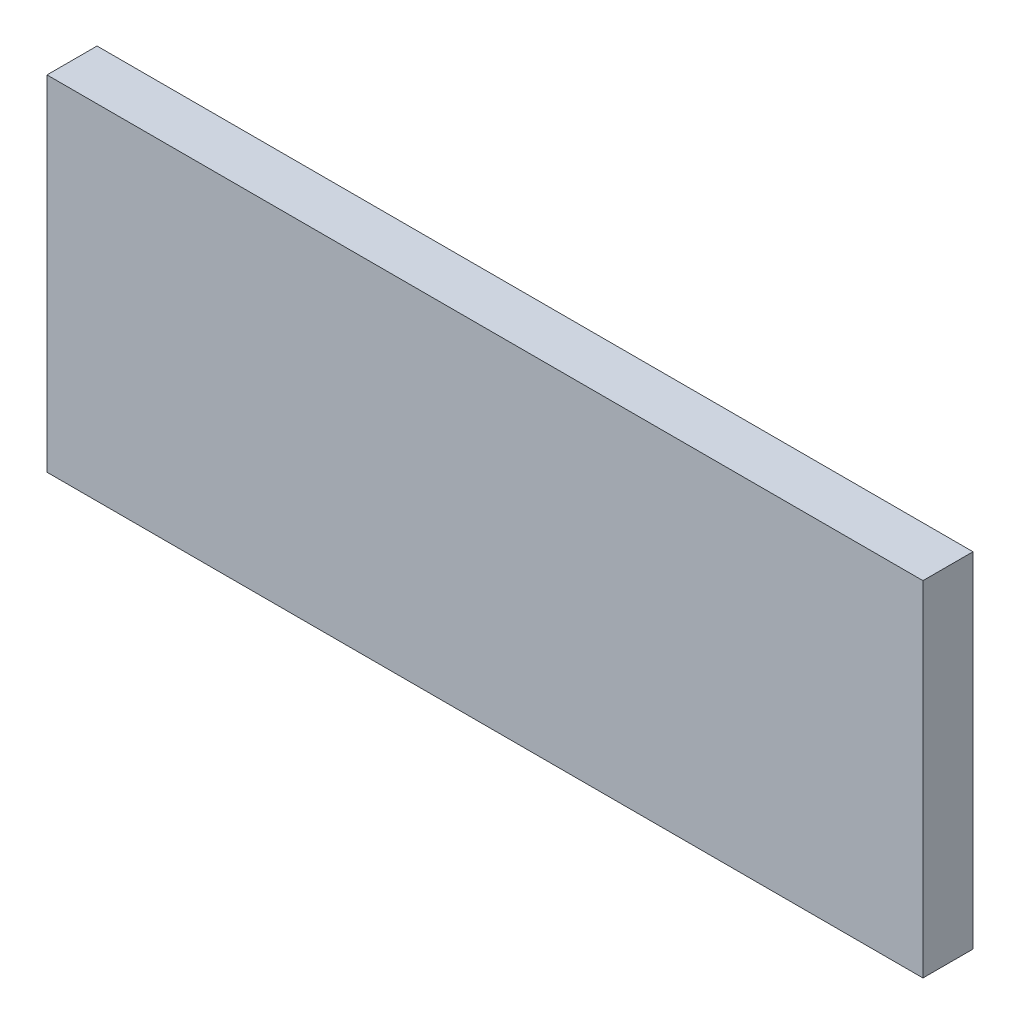
ISO-10303-21;
HEADER;
FILE_DESCRIPTION(('STEP AP214'),'2;1');
FILE_NAME('part.step','',(''),(''),'','','');
FILE_SCHEMA(('AUTOMOTIVE_DESIGN { 1 0 10303 214 1 1 1 1 }'));
ENDSEC;
DATA;
#1=APPLICATION_CONTEXT('core data for automotive mechanical design processes');
#2=APPLICATION_PROTOCOL_DEFINITION('international standard','automotive_design',2000,#1);
#3=PRODUCT_CONTEXT('',#1,'mechanical');
#4=PRODUCT('Part','Part','',(#3));
#5=PRODUCT_RELATED_PRODUCT_CATEGORY('part','',(#4));
#6=PRODUCT_DEFINITION_FORMATION('','',#4);
#7=PRODUCT_DEFINITION_CONTEXT('part definition',#1,'design');
#8=PRODUCT_DEFINITION('design','',#6,#7);
#9=PRODUCT_DEFINITION_SHAPE('','',#8);
#10=(LENGTH_UNIT() NAMED_UNIT(*) SI_UNIT(.MILLI.,.METRE.));
#11=(NAMED_UNIT(*) PLANE_ANGLE_UNIT() SI_UNIT($,.RADIAN.));
#12=(NAMED_UNIT(*) SI_UNIT($,.STERADIAN.) SOLID_ANGLE_UNIT());
#13=UNCERTAINTY_MEASURE_WITH_UNIT(LENGTH_MEASURE(1.E-05),#10,'distance_accuracy_value','');
#14=(GEOMETRIC_REPRESENTATION_CONTEXT(3) GLOBAL_UNCERTAINTY_ASSIGNED_CONTEXT((#13)) GLOBAL_UNIT_ASSIGNED_CONTEXT((#10,
#11,#12)) REPRESENTATION_CONTEXT('',''));
#15=CARTESIAN_POINT('',(0.,0.,0.));
#16=DIRECTION('',(0.,0.,1.));
#17=DIRECTION('',(1.,0.,0.));
#18=AXIS2_PLACEMENT_3D('',#15,#16,#17);
#19=CARTESIAN_POINT('',(-70.,55.,4.));
#20=DIRECTION('',(0.,0.,-1.));
#21=DIRECTION('',(-1.,0.,0.));
#22=AXIS2_PLACEMENT_3D('',#19,#20,#21);
#23=PLANE('',#22);
#24=DIRECTION('',(0.,1.,0.));
#25=VECTOR('',#24,1.);
#26=CARTESIAN_POINT('',(70.,55.,4.));
#27=LINE('',#26,#25);
#28=CARTESIAN_POINT('',(70.,0.,4.));
#29=VERTEX_POINT('',#28);
#30=CARTESIAN_POINT('',(70.,55.,4.));
#31=VERTEX_POINT('',#30);
#32=EDGE_CURVE('E20',#29,#31,#27,.T.);
#33=ORIENTED_EDGE('',*,*,#32,.T.);
#34=DIRECTION('',(1.,0.,0.));
#35=VECTOR('',#34,1.);
#36=CARTESIAN_POINT('',(0.,55.,4.));
#37=LINE('',#36,#35);
#38=CARTESIAN_POINT('',(-70.,55.,4.));
#39=VERTEX_POINT('',#38);
#40=EDGE_CURVE('E55',#31,#39,#37,.F.);
#41=ORIENTED_EDGE('',*,*,#40,.T.);
#42=DIRECTION('',(0.,1.,0.));
#43=VECTOR('',#42,1.);
#44=CARTESIAN_POINT('',(-70.,55.,4.));
#45=LINE('',#44,#43);
#46=CARTESIAN_POINT('',(-70.,0.,4.));
#47=VERTEX_POINT('',#46);
#48=EDGE_CURVE('E74',#39,#47,#45,.F.);
#49=ORIENTED_EDGE('',*,*,#48,.T.);
#50=DIRECTION('',(1.,0.,0.));
#51=VECTOR('',#50,1.);
#52=CARTESIAN_POINT('',(0.,0.,4.));
#53=LINE('',#52,#51);
#54=EDGE_CURVE('E66',#29,#47,#53,.F.);
#55=ORIENTED_EDGE('',*,*,#54,.F.);
#56=EDGE_LOOP('',(#33,#41,#49,#55));
#57=FACE_BOUND('',#56,.T.);
#58=ADVANCED_FACE('F17',(#57),#23,.F.);
#59=CARTESIAN_POINT('',(70.,55.,4.));
#60=DIRECTION('',(-1.,0.,0.));
#61=DIRECTION('',(0.,0.,1.));
#62=AXIS2_PLACEMENT_3D('',#59,#60,#61);
#63=PLANE('',#62);
#64=DIRECTION('',(0.,1.,0.));
#65=VECTOR('',#64,1.);
#66=CARTESIAN_POINT('',(70.,55.,-4.));
#67=LINE('',#66,#65);
#68=CARTESIAN_POINT('',(70.,0.,-4.));
#69=VERTEX_POINT('',#68);
#70=CARTESIAN_POINT('',(70.,55.,-4.));
#71=VERTEX_POINT('',#70);
#72=EDGE_CURVE('E72',#69,#71,#67,.T.);
#73=ORIENTED_EDGE('',*,*,#72,.T.);
#74=DIRECTION('',(0.,0.,-1.));
#75=VECTOR('',#74,1.);
#76=CARTESIAN_POINT('',(70.,55.,0.));
#77=LINE('',#76,#75);
#78=EDGE_CURVE('E62',#71,#31,#77,.F.);
#79=ORIENTED_EDGE('',*,*,#78,.T.);
#80=ORIENTED_EDGE('',*,*,#32,.F.);
#81=DIRECTION('',(0.,0.,-1.));
#82=VECTOR('',#81,1.);
#83=CARTESIAN_POINT('',(70.,0.,0.));
#84=LINE('',#83,#82);
#85=EDGE_CURVE('E78',#69,#29,#84,.F.);
#86=ORIENTED_EDGE('',*,*,#85,.F.);
#87=EDGE_LOOP('',(#73,#79,#80,#86));
#88=FACE_BOUND('',#87,.T.);
#89=ADVANCED_FACE('F71',(#88),#63,.F.);
#90=CARTESIAN_POINT('',(0.,55.,0.));
#91=DIRECTION('',(0.,-1.,0.));
#92=DIRECTION('',(0.,0.,-1.));
#93=AXIS2_PLACEMENT_3D('',#90,#91,#92);
#94=PLANE('',#93);
#95=DIRECTION('',(1.,0.,0.));
#96=VECTOR('',#95,1.);
#97=CARTESIAN_POINT('',(-70.,55.,-4.));
#98=LINE('',#97,#96);
#99=CARTESIAN_POINT('',(-70.,55.,-4.));
#100=VERTEX_POINT('',#99);
#101=EDGE_CURVE('E83',#71,#100,#98,.F.);
#102=ORIENTED_EDGE('',*,*,#101,.T.);
#103=DIRECTION('',(0.,0.,-1.));
#104=VECTOR('',#103,1.);
#105=CARTESIAN_POINT('',(-70.,55.,4.));
#106=LINE('',#105,#104);
#107=EDGE_CURVE('E64',#100,#39,#106,.F.);
#108=ORIENTED_EDGE('',*,*,#107,.T.);
#109=ORIENTED_EDGE('',*,*,#40,.F.);
#110=ORIENTED_EDGE('',*,*,#78,.F.);
#111=EDGE_LOOP('',(#102,#108,#109,#110));
#112=FACE_BOUND('',#111,.T.);
#113=ADVANCED_FACE('F60',(#112),#94,.F.);
#114=CARTESIAN_POINT('',(-70.,55.,4.));
#115=DIRECTION('',(1.,0.,0.));
#116=DIRECTION('',(0.,0.,-1.));
#117=AXIS2_PLACEMENT_3D('',#114,#115,#116);
#118=PLANE('',#117);
#119=ORIENTED_EDGE('',*,*,#48,.F.);
#120=ORIENTED_EDGE('',*,*,#107,.F.);
#121=DIRECTION('',(0.,1.,0.));
#122=VECTOR('',#121,1.);
#123=CARTESIAN_POINT('',(-70.,55.,-4.));
#124=LINE('',#123,#122);
#125=CARTESIAN_POINT('',(-70.,0.,-4.));
#126=VERTEX_POINT('',#125);
#127=EDGE_CURVE('E26',#100,#126,#124,.F.);
#128=ORIENTED_EDGE('',*,*,#127,.T.);
#129=DIRECTION('',(0.,0.,-1.));
#130=VECTOR('',#129,1.);
#131=CARTESIAN_POINT('',(-70.,0.,0.));
#132=LINE('',#131,#130);
#133=EDGE_CURVE('E34',#47,#126,#132,.T.);
#134=ORIENTED_EDGE('',*,*,#133,.F.);
#135=EDGE_LOOP('',(#119,#120,#128,#134));
#136=FACE_BOUND('',#135,.T.);
#137=ADVANCED_FACE('F88',(#136),#118,.F.);
#138=CARTESIAN_POINT('',(0.,0.,0.));
#139=DIRECTION('',(0.,-1.,0.));
#140=DIRECTION('',(0.,0.,-1.));
#141=AXIS2_PLACEMENT_3D('',#138,#139,#140);
#142=PLANE('',#141);
#143=ORIENTED_EDGE('',*,*,#133,.T.);
#144=DIRECTION('',(1.,0.,0.));
#145=VECTOR('',#144,1.);
#146=CARTESIAN_POINT('',(-70.,0.,-4.));
#147=LINE('',#146,#145);
#148=EDGE_CURVE('E11',#126,#69,#147,.T.);
#149=ORIENTED_EDGE('',*,*,#148,.T.);
#150=ORIENTED_EDGE('',*,*,#85,.T.);
#151=ORIENTED_EDGE('',*,*,#54,.T.);
#152=EDGE_LOOP('',(#143,#149,#150,#151));
#153=FACE_BOUND('',#152,.T.);
#154=ADVANCED_FACE('F91',(#153),#142,.T.);
#155=CARTESIAN_POINT('',(-70.,55.,-4.));
#156=DIRECTION('',(0.,0.,1.));
#157=DIRECTION('',(1.,0.,0.));
#158=AXIS2_PLACEMENT_3D('',#155,#156,#157);
#159=PLANE('',#158);
#160=ORIENTED_EDGE('',*,*,#127,.F.);
#161=ORIENTED_EDGE('',*,*,#101,.F.);
#162=ORIENTED_EDGE('',*,*,#72,.F.);
#163=ORIENTED_EDGE('',*,*,#148,.F.);
#164=EDGE_LOOP('',(#160,#161,#162,#163));
#165=FACE_BOUND('',#164,.T.);
#166=ADVANCED_FACE('F90',(#165),#159,.F.);
#167=CLOSED_SHELL('',(#58,#89,#113,#137,#154,#166));
#168=MANIFOLD_SOLID_BREP('B1',#167);
#169=ADVANCED_BREP_SHAPE_REPRESENTATION('',(#18,#168),#14);
#170=SHAPE_DEFINITION_REPRESENTATION(#9,#169);
ENDSEC;
END-ISO-10303-21;
